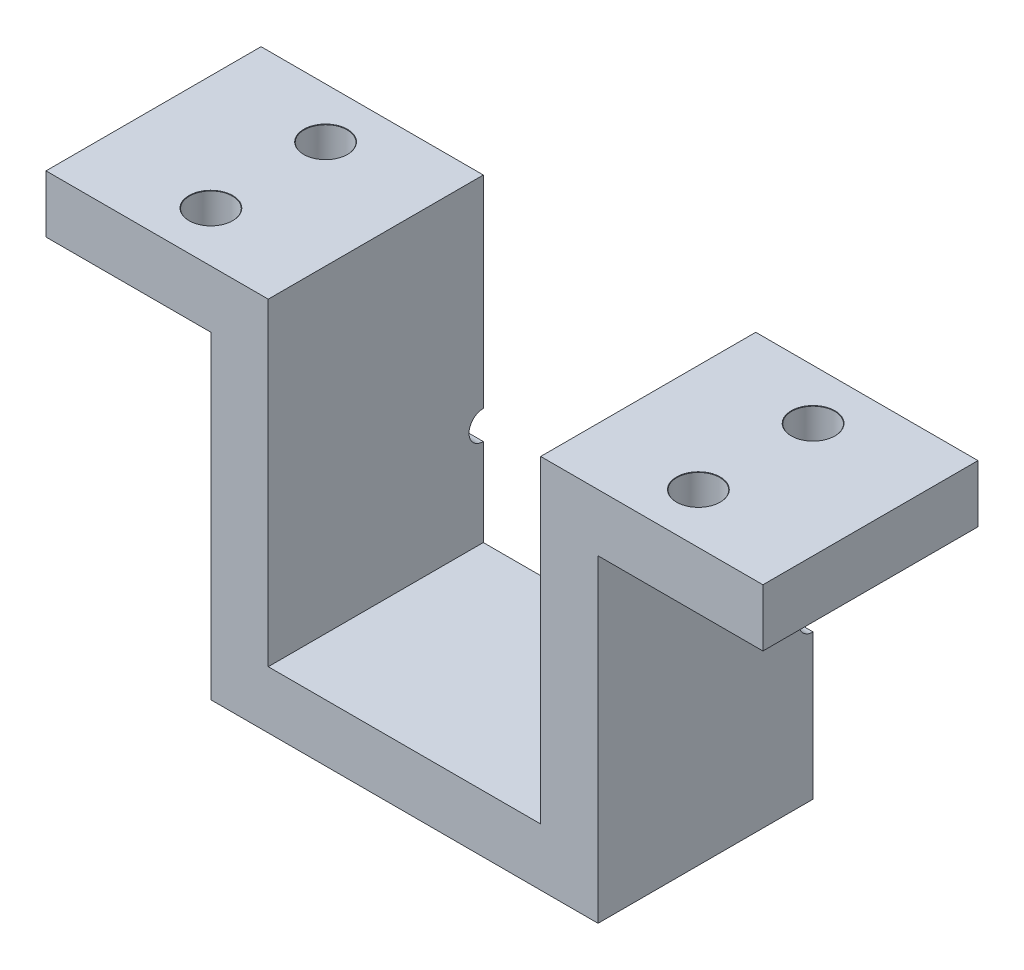
ISO-10303-21;
HEADER;
FILE_DESCRIPTION(('STEP AP214'),'2;1');
FILE_NAME('part.step','',(''),(''),'','','');
FILE_SCHEMA(('AUTOMOTIVE_DESIGN { 1 0 10303 214 1 1 1 1 }'));
ENDSEC;
DATA;
#1=APPLICATION_CONTEXT('core data for automotive mechanical design processes');
#2=APPLICATION_PROTOCOL_DEFINITION('international standard','automotive_design',2000,#1);
#3=PRODUCT_CONTEXT('',#1,'mechanical');
#4=PRODUCT('Part','Part','',(#3));
#5=PRODUCT_RELATED_PRODUCT_CATEGORY('part','',(#4));
#6=PRODUCT_DEFINITION_FORMATION('','',#4);
#7=PRODUCT_DEFINITION_CONTEXT('part definition',#1,'design');
#8=PRODUCT_DEFINITION('design','',#6,#7);
#9=PRODUCT_DEFINITION_SHAPE('','',#8);
#10=(LENGTH_UNIT() NAMED_UNIT(*) SI_UNIT(.MILLI.,.METRE.));
#11=(NAMED_UNIT(*) PLANE_ANGLE_UNIT() SI_UNIT($,.RADIAN.));
#12=(NAMED_UNIT(*) SI_UNIT($,.STERADIAN.) SOLID_ANGLE_UNIT());
#13=UNCERTAINTY_MEASURE_WITH_UNIT(LENGTH_MEASURE(1.E-05),#10,'distance_accuracy_value','');
#14=(GEOMETRIC_REPRESENTATION_CONTEXT(3) GLOBAL_UNCERTAINTY_ASSIGNED_CONTEXT((#13)) GLOBAL_UNIT_ASSIGNED_CONTEXT((#10,
#11,#12)) REPRESENTATION_CONTEXT('',''));
#15=CARTESIAN_POINT('',(0.,0.,0.));
#16=DIRECTION('',(0.,0.,1.));
#17=DIRECTION('',(1.,0.,0.));
#18=AXIS2_PLACEMENT_3D('',#15,#16,#17);
#19=CARTESIAN_POINT('',(0.,22.2,-15.));
#20=DIRECTION('',(0.,0.,1.));
#21=DIRECTION('',(1.,0.,0.));
#22=AXIS2_PLACEMENT_3D('',#19,#20,#21);
#23=PLANE('',#22);
#24=DIRECTION('',(-1.,0.,0.));
#25=VECTOR('',#24,1.);
#26=CARTESIAN_POINT('',(-11.5,26.2,-15.));
#27=LINE('',#26,#25);
#28=CARTESIAN_POINT('',(4.,26.2,-15.));
#29=VERTEX_POINT('',#28);
#30=CARTESIAN_POINT('',(-11.5,26.2,-15.));
#31=VERTEX_POINT('',#30);
#32=EDGE_CURVE('E165',#29,#31,#27,.T.);
#33=ORIENTED_EDGE('',*,*,#32,.F.);
#34=DIRECTION('',(0.,-1.,0.));
#35=VECTOR('',#34,1.);
#36=CARTESIAN_POINT('',(4.,22.2,-15.));
#37=LINE('',#36,#35);
#38=CARTESIAN_POINT('',(4.,12.1,-15.));
#39=VERTEX_POINT('',#38);
#40=EDGE_CURVE('E151',#29,#39,#37,.T.);
#41=ORIENTED_EDGE('',*,*,#40,.T.);
#42=DIRECTION('',(-1.,0.,0.));
#43=VECTOR('',#42,1.);
#44=CARTESIAN_POINT('',(32.2,12.1,-15.));
#45=LINE('',#44,#43);
#46=CARTESIAN_POINT('',(0.,12.1,-15.));
#47=VERTEX_POINT('',#46);
#48=EDGE_CURVE('E54',#39,#47,#45,.T.);
#49=ORIENTED_EDGE('',*,*,#48,.T.);
#50=DIRECTION('',(0.,-1.,0.));
#51=VECTOR('',#50,1.);
#52=CARTESIAN_POINT('',(0.,22.2,-15.));
#53=LINE('',#52,#51);
#54=CARTESIAN_POINT('',(0.,22.2,-15.));
#55=VERTEX_POINT('',#54);
#56=EDGE_CURVE('E254',#55,#47,#53,.T.);
#57=ORIENTED_EDGE('',*,*,#56,.F.);
#58=DIRECTION('',(-1.,0.,0.));
#59=VECTOR('',#58,1.);
#60=CARTESIAN_POINT('',(-11.5,22.2,-15.));
#61=LINE('',#60,#59);
#62=CARTESIAN_POINT('',(-11.5,22.2,-15.));
#63=VERTEX_POINT('',#62);
#64=EDGE_CURVE('E190',#55,#63,#61,.T.);
#65=ORIENTED_EDGE('',*,*,#64,.T.);
#66=DIRECTION('',(0.,-1.,0.));
#67=VECTOR('',#66,1.);
#68=CARTESIAN_POINT('',(-11.5,26.2,-15.));
#69=LINE('',#68,#67);
#70=EDGE_CURVE('E173',#31,#63,#69,.T.);
#71=ORIENTED_EDGE('',*,*,#70,.F.);
#72=EDGE_LOOP('',(#33,#41,#49,#57,#65,#71));
#73=FACE_BOUND('',#72,.T.);
#74=ADVANCED_FACE('F37',(#73),#23,.F.);
#75=CARTESIAN_POINT('',(0.,26.2,0.));
#76=DIRECTION('',(0.,-1.,0.));
#77=DIRECTION('',(0.,0.,-1.));
#78=AXIS2_PLACEMENT_3D('',#75,#76,#77);
#79=PLANE('',#78);
#80=CARTESIAN_POINT('',(-3.5,26.2,-11.5));
#81=DIRECTION('',(0.,1.,0.));
#82=DIRECTION('',(0.,0.,1.));
#83=AXIS2_PLACEMENT_3D('',#80,#81,#82);
#84=CIRCLE('',#83,1.525);
#85=CARTESIAN_POINT('',(-3.5,26.2,-9.975));
#86=VERTEX_POINT('',#85);
#87=EDGE_CURVE('E644',#86,#86,#84,.T.);
#88=ORIENTED_EDGE('',*,*,#87,.F.);
#89=EDGE_LOOP('',(#88));
#90=FACE_BOUND('',#89,.T.);
#91=CARTESIAN_POINT('',(-3.5,26.2,-3.5));
#92=DIRECTION('',(0.,1.,0.));
#93=DIRECTION('',(0.,0.,1.));
#94=AXIS2_PLACEMENT_3D('',#91,#92,#93);
#95=CIRCLE('',#94,1.525);
#96=CARTESIAN_POINT('',(-3.5,26.2,-1.975));
#97=VERTEX_POINT('',#96);
#98=EDGE_CURVE('E283',#97,#97,#95,.T.);
#99=ORIENTED_EDGE('',*,*,#98,.F.);
#100=EDGE_LOOP('',(#99));
#101=FACE_BOUND('',#100,.T.);
#102=DIRECTION('',(1.,0.,0.));
#103=VECTOR('',#102,1.);
#104=CARTESIAN_POINT('',(-11.5,26.2,0.));
#105=LINE('',#104,#103);
#106=CARTESIAN_POINT('',(-11.5,26.2,0.));
#107=VERTEX_POINT('',#106);
#108=CARTESIAN_POINT('',(4.,26.2,0.));
#109=VERTEX_POINT('',#108);
#110=EDGE_CURVE('E168',#107,#109,#105,.T.);
#111=ORIENTED_EDGE('',*,*,#110,.T.);
#112=DIRECTION('',(0.,0.,-1.));
#113=VECTOR('',#112,1.);
#114=CARTESIAN_POINT('',(4.,26.2,0.));
#115=LINE('',#114,#113);
#116=EDGE_CURVE('E154',#109,#29,#115,.T.);
#117=ORIENTED_EDGE('',*,*,#116,.T.);
#118=ORIENTED_EDGE('',*,*,#32,.T.);
#119=DIRECTION('',(0.,0.,1.));
#120=VECTOR('',#119,1.);
#121=CARTESIAN_POINT('',(-11.5,26.2,0.));
#122=LINE('',#121,#120);
#123=EDGE_CURVE('E179',#31,#107,#122,.T.);
#124=ORIENTED_EDGE('',*,*,#123,.T.);
#125=EDGE_LOOP('',(#111,#117,#118,#124));
#126=FACE_BOUND('',#125,.T.);
#127=ADVANCED_FACE('F164',(#90,#101,#126),#79,.F.);
#128=DIRECTION('',(0.,-1.,0.));
#129=VECTOR('',#128,1.);
#130=CARTESIAN_POINT('',(23.,22.2,-15.));
#131=LINE('',#130,#129);
#132=CARTESIAN_POINT('',(23.,26.2,-15.));
#133=VERTEX_POINT('',#132);
#134=CARTESIAN_POINT('',(23.,12.1,-15.));
#135=VERTEX_POINT('',#134);
#136=EDGE_CURVE('E234',#133,#135,#131,.T.);
#137=ORIENTED_EDGE('',*,*,#136,.F.);
#138=CARTESIAN_POINT('',(38.5,26.2,-15.));
#139=VERTEX_POINT('',#138);
#140=EDGE_CURVE('E175',#139,#133,#27,.T.);
#141=ORIENTED_EDGE('',*,*,#140,.F.);
#142=DIRECTION('',(0.,-1.,0.));
#143=VECTOR('',#142,1.);
#144=CARTESIAN_POINT('',(38.5,26.2,-15.));
#145=LINE('',#144,#143);
#146=CARTESIAN_POINT('',(38.5,22.2,-15.));
#147=VERTEX_POINT('',#146);
#148=EDGE_CURVE('E205',#139,#147,#145,.T.);
#149=ORIENTED_EDGE('',*,*,#148,.T.);
#150=CARTESIAN_POINT('',(27.,22.2,-15.));
#151=VERTEX_POINT('',#150);
#152=EDGE_CURVE('E191',#147,#151,#61,.T.);
#153=ORIENTED_EDGE('',*,*,#152,.T.);
#154=DIRECTION('',(0.,-1.,0.));
#155=VECTOR('',#154,1.);
#156=CARTESIAN_POINT('',(27.,22.2,-15.));
#157=LINE('',#156,#155);
#158=CARTESIAN_POINT('',(27.,12.1,-15.));
#159=VERTEX_POINT('',#158);
#160=EDGE_CURVE('E258',#151,#159,#157,.T.);
#161=ORIENTED_EDGE('',*,*,#160,.T.);
#162=EDGE_CURVE('E211',#159,#135,#45,.T.);
#163=ORIENTED_EDGE('',*,*,#162,.T.);
#164=EDGE_LOOP('',(#137,#141,#149,#153,#161,#163));
#165=FACE_BOUND('',#164,.T.);
#166=ADVANCED_FACE('F314',(#165),#23,.F.);
#167=CARTESIAN_POINT('',(0.,22.2,0.));
#168=DIRECTION('',(1.,0.,0.));
#169=DIRECTION('',(0.,0.,-1.));
#170=AXIS2_PLACEMENT_3D('',#167,#168,#169);
#171=PLANE('',#170);
#172=ORIENTED_EDGE('',*,*,#56,.T.);
#173=CARTESIAN_POINT('',(0.,11.1,-15.));
#174=DIRECTION('',(-1.,0.,0.));
#175=DIRECTION('',(0.,0.,1.));
#176=AXIS2_PLACEMENT_3D('',#173,#174,#175);
#177=CIRCLE('',#176,1.);
#178=CARTESIAN_POINT('',(0.,10.1,-15.));
#179=VERTEX_POINT('',#178);
#180=EDGE_CURVE('E208',#179,#47,#177,.T.);
#181=ORIENTED_EDGE('',*,*,#180,.F.);
#182=CARTESIAN_POINT('',(0.,0.,-15.));
#183=VERTEX_POINT('',#182);
#184=EDGE_CURVE('E244',#179,#183,#53,.T.);
#185=ORIENTED_EDGE('',*,*,#184,.T.);
#186=DIRECTION('',(0.,0.,1.));
#187=VECTOR('',#186,1.);
#188=CARTESIAN_POINT('',(0.,0.,0.));
#189=LINE('',#188,#187);
#190=CARTESIAN_POINT('',(0.,0.,0.));
#191=VERTEX_POINT('',#190);
#192=EDGE_CURVE('E229',#183,#191,#189,.T.);
#193=ORIENTED_EDGE('',*,*,#192,.T.);
#194=DIRECTION('',(0.,-1.,0.));
#195=VECTOR('',#194,1.);
#196=CARTESIAN_POINT('',(0.,22.2,0.));
#197=LINE('',#196,#195);
#198=CARTESIAN_POINT('',(0.,22.2,0.));
#199=VERTEX_POINT('',#198);
#200=EDGE_CURVE('E46',#199,#191,#197,.T.);
#201=ORIENTED_EDGE('',*,*,#200,.F.);
#202=DIRECTION('',(0.,0.,1.));
#203=VECTOR('',#202,1.);
#204=CARTESIAN_POINT('',(0.,22.2,0.));
#205=LINE('',#204,#203);
#206=EDGE_CURVE('E239',#55,#199,#205,.T.);
#207=ORIENTED_EDGE('',*,*,#206,.F.);
#208=EDGE_LOOP('',(#172,#181,#185,#193,#201,#207));
#209=FACE_BOUND('',#208,.T.);
#210=ADVANCED_FACE('F39',(#209),#171,.F.);
#211=CARTESIAN_POINT('',(0.,22.2,0.));
#212=DIRECTION('',(0.,0.,-1.));
#213=DIRECTION('',(-1.,0.,0.));
#214=AXIS2_PLACEMENT_3D('',#211,#212,#213);
#215=PLANE('',#214);
#216=DIRECTION('',(0.,-1.,0.));
#217=VECTOR('',#216,1.);
#218=CARTESIAN_POINT('',(4.,22.2,0.));
#219=LINE('',#218,#217);
#220=CARTESIAN_POINT('',(4.,4.,0.));
#221=VERTEX_POINT('',#220);
#222=EDGE_CURVE('E227',#109,#221,#219,.T.);
#223=ORIENTED_EDGE('',*,*,#222,.F.);
#224=ORIENTED_EDGE('',*,*,#110,.F.);
#225=DIRECTION('',(0.,-1.,0.));
#226=VECTOR('',#225,1.);
#227=CARTESIAN_POINT('',(-11.5,26.2,0.));
#228=LINE('',#227,#226);
#229=CARTESIAN_POINT('',(-11.5,22.2,0.));
#230=VERTEX_POINT('',#229);
#231=EDGE_CURVE('E201',#107,#230,#228,.T.);
#232=ORIENTED_EDGE('',*,*,#231,.T.);
#233=DIRECTION('',(1.,0.,0.));
#234=VECTOR('',#233,1.);
#235=CARTESIAN_POINT('',(-11.5,22.2,0.));
#236=LINE('',#235,#234);
#237=EDGE_CURVE('E181',#230,#199,#236,.T.);
#238=ORIENTED_EDGE('',*,*,#237,.T.);
#239=ORIENTED_EDGE('',*,*,#200,.T.);
#240=DIRECTION('',(1.,0.,0.));
#241=VECTOR('',#240,1.);
#242=CARTESIAN_POINT('',(0.,0.,0.));
#243=LINE('',#242,#241);
#244=CARTESIAN_POINT('',(27.,0.,0.));
#245=VERTEX_POINT('',#244);
#246=EDGE_CURVE('E247',#191,#245,#243,.T.);
#247=ORIENTED_EDGE('',*,*,#246,.T.);
#248=DIRECTION('',(0.,-1.,0.));
#249=VECTOR('',#248,1.);
#250=CARTESIAN_POINT('',(27.,22.2,0.));
#251=LINE('',#250,#249);
#252=CARTESIAN_POINT('',(27.,22.2,0.));
#253=VERTEX_POINT('',#252);
#254=EDGE_CURVE('E261',#253,#245,#251,.T.);
#255=ORIENTED_EDGE('',*,*,#254,.F.);
#256=CARTESIAN_POINT('',(38.5,22.2,0.));
#257=VERTEX_POINT('',#256);
#258=EDGE_CURVE('E196',#253,#257,#236,.T.);
#259=ORIENTED_EDGE('',*,*,#258,.T.);
#260=DIRECTION('',(0.,-1.,0.));
#261=VECTOR('',#260,1.);
#262=CARTESIAN_POINT('',(38.5,26.2,0.));
#263=LINE('',#262,#261);
#264=CARTESIAN_POINT('',(38.5,26.2,0.));
#265=VERTEX_POINT('',#264);
#266=EDGE_CURVE('E187',#265,#257,#263,.T.);
#267=ORIENTED_EDGE('',*,*,#266,.F.);
#268=CARTESIAN_POINT('',(23.,26.2,0.));
#269=VERTEX_POINT('',#268);
#270=EDGE_CURVE('E185',#269,#265,#105,.T.);
#271=ORIENTED_EDGE('',*,*,#270,.F.);
#272=DIRECTION('',(0.,-1.,0.));
#273=VECTOR('',#272,1.);
#274=CARTESIAN_POINT('',(23.,22.2,0.));
#275=LINE('',#274,#273);
#276=CARTESIAN_POINT('',(23.,4.,0.));
#277=VERTEX_POINT('',#276);
#278=EDGE_CURVE('E230',#269,#277,#275,.T.);
#279=ORIENTED_EDGE('',*,*,#278,.T.);
#280=DIRECTION('',(1.,0.,0.));
#281=VECTOR('',#280,1.);
#282=CARTESIAN_POINT('',(0.,4.,0.));
#283=LINE('',#282,#281);
#284=EDGE_CURVE('E222',#221,#277,#283,.T.);
#285=ORIENTED_EDGE('',*,*,#284,.F.);
#286=EDGE_LOOP('',(#223,#224,#232,#238,#239,#247,#255,#259,#267,#271,#279,#285));
#287=FACE_BOUND('',#286,.T.);
#288=ADVANCED_FACE('F305',(#287),#215,.F.);
#289=CARTESIAN_POINT('',(27.,22.2,0.));
#290=DIRECTION('',(-1.,0.,0.));
#291=DIRECTION('',(0.,0.,1.));
#292=AXIS2_PLACEMENT_3D('',#289,#290,#291);
#293=PLANE('',#292);
#294=CARTESIAN_POINT('',(27.,10.1,-15.));
#295=VERTEX_POINT('',#294);
#296=CARTESIAN_POINT('',(27.,0.,-15.));
#297=VERTEX_POINT('',#296);
#298=EDGE_CURVE('E257',#295,#297,#157,.T.);
#299=ORIENTED_EDGE('',*,*,#298,.F.);
#300=CARTESIAN_POINT('',(27.,11.1,-15.));
#301=DIRECTION('',(-1.,0.,0.));
#302=DIRECTION('',(0.,0.,1.));
#303=AXIS2_PLACEMENT_3D('',#300,#301,#302);
#304=CIRCLE('',#303,1.);
#305=EDGE_CURVE('E215',#295,#159,#304,.T.);
#306=ORIENTED_EDGE('',*,*,#305,.T.);
#307=ORIENTED_EDGE('',*,*,#160,.F.);
#308=DIRECTION('',(0.,0.,-1.));
#309=VECTOR('',#308,1.);
#310=CARTESIAN_POINT('',(27.,22.2,0.));
#311=LINE('',#310,#309);
#312=EDGE_CURVE('E241',#253,#151,#311,.T.);
#313=ORIENTED_EDGE('',*,*,#312,.F.);
#314=ORIENTED_EDGE('',*,*,#254,.T.);
#315=DIRECTION('',(0.,0.,-1.));
#316=VECTOR('',#315,1.);
#317=CARTESIAN_POINT('',(27.,0.,0.));
#318=LINE('',#317,#316);
#319=EDGE_CURVE('E249',#245,#297,#318,.T.);
#320=ORIENTED_EDGE('',*,*,#319,.T.);
#321=EDGE_LOOP('',(#299,#306,#307,#313,#314,#320));
#322=FACE_BOUND('',#321,.T.);
#323=ADVANCED_FACE('F344',(#322),#293,.F.);
#324=ORIENTED_EDGE('',*,*,#184,.F.);
#325=DIRECTION('',(-1.,0.,0.));
#326=VECTOR('',#325,1.);
#327=CARTESIAN_POINT('',(32.2,10.1,-15.));
#328=LINE('',#327,#326);
#329=CARTESIAN_POINT('',(4.,10.1,-15.));
#330=VERTEX_POINT('',#329);
#331=EDGE_CURVE('E212',#179,#330,#328,.F.);
#332=ORIENTED_EDGE('',*,*,#331,.T.);
#333=CARTESIAN_POINT('',(4.,4.,-15.));
#334=VERTEX_POINT('',#333);
#335=EDGE_CURVE('E161',#330,#334,#37,.T.);
#336=ORIENTED_EDGE('',*,*,#335,.T.);
#337=DIRECTION('',(-1.,0.,0.));
#338=VECTOR('',#337,1.);
#339=CARTESIAN_POINT('',(0.,4.,-15.));
#340=LINE('',#339,#338);
#341=CARTESIAN_POINT('',(23.,4.,-15.));
#342=VERTEX_POINT('',#341);
#343=EDGE_CURVE('E226',#342,#334,#340,.T.);
#344=ORIENTED_EDGE('',*,*,#343,.F.);
#345=CARTESIAN_POINT('',(23.,10.1,-15.));
#346=VERTEX_POINT('',#345);
#347=EDGE_CURVE('E160',#346,#342,#131,.T.);
#348=ORIENTED_EDGE('',*,*,#347,.F.);
#349=EDGE_CURVE('E61',#346,#295,#328,.F.);
#350=ORIENTED_EDGE('',*,*,#349,.T.);
#351=ORIENTED_EDGE('',*,*,#298,.T.);
#352=DIRECTION('',(-1.,0.,0.));
#353=VECTOR('',#352,1.);
#354=CARTESIAN_POINT('',(0.,0.,-15.));
#355=LINE('',#354,#353);
#356=EDGE_CURVE('E242',#297,#183,#355,.T.);
#357=ORIENTED_EDGE('',*,*,#356,.T.);
#358=EDGE_LOOP('',(#324,#332,#336,#344,#348,#350,#351,#357));
#359=FACE_BOUND('',#358,.T.);
#360=ADVANCED_FACE('F322',(#359),#23,.F.);
#361=CARTESIAN_POINT('',(0.,0.,0.));
#362=DIRECTION('',(0.,-1.,0.));
#363=DIRECTION('',(0.,0.,-1.));
#364=AXIS2_PLACEMENT_3D('',#361,#362,#363);
#365=PLANE('',#364);
#366=ORIENTED_EDGE('',*,*,#192,.F.);
#367=ORIENTED_EDGE('',*,*,#356,.F.);
#368=ORIENTED_EDGE('',*,*,#319,.F.);
#369=ORIENTED_EDGE('',*,*,#246,.F.);
#370=EDGE_LOOP('',(#366,#367,#368,#369));
#371=FACE_BOUND('',#370,.T.);
#372=ADVANCED_FACE('F346',(#371),#365,.T.);
#373=CARTESIAN_POINT('',(4.,22.2,0.));
#374=DIRECTION('',(1.,0.,0.));
#375=DIRECTION('',(0.,0.,-1.));
#376=AXIS2_PLACEMENT_3D('',#373,#374,#375);
#377=PLANE('',#376);
#378=CARTESIAN_POINT('',(4.,11.1,-15.));
#379=DIRECTION('',(1.,0.,0.));
#380=DIRECTION('',(0.,0.,-1.));
#381=AXIS2_PLACEMENT_3D('',#378,#379,#380);
#382=CIRCLE('',#381,1.);
#383=EDGE_CURVE('E157',#39,#330,#382,.T.);
#384=ORIENTED_EDGE('',*,*,#383,.F.);
#385=ORIENTED_EDGE('',*,*,#40,.F.);
#386=ORIENTED_EDGE('',*,*,#116,.F.);
#387=ORIENTED_EDGE('',*,*,#222,.T.);
#388=DIRECTION('',(0.,0.,1.));
#389=VECTOR('',#388,1.);
#390=CARTESIAN_POINT('',(4.,4.,0.));
#391=LINE('',#390,#389);
#392=EDGE_CURVE('E219',#334,#221,#391,.T.);
#393=ORIENTED_EDGE('',*,*,#392,.F.);
#394=ORIENTED_EDGE('',*,*,#335,.F.);
#395=EDGE_LOOP('',(#384,#385,#386,#387,#393,#394));
#396=FACE_BOUND('',#395,.T.);
#397=ADVANCED_FACE('F153',(#396),#377,.T.);
#398=CARTESIAN_POINT('',(23.,22.2,0.));
#399=DIRECTION('',(-1.,0.,0.));
#400=DIRECTION('',(0.,0.,1.));
#401=AXIS2_PLACEMENT_3D('',#398,#399,#400);
#402=PLANE('',#401);
#403=CARTESIAN_POINT('',(23.,11.1,-15.));
#404=DIRECTION('',(-1.,0.,0.));
#405=DIRECTION('',(0.,0.,1.));
#406=AXIS2_PLACEMENT_3D('',#403,#404,#405);
#407=CIRCLE('',#406,1.);
#408=EDGE_CURVE('E11',#346,#135,#407,.T.);
#409=ORIENTED_EDGE('',*,*,#408,.F.);
#410=ORIENTED_EDGE('',*,*,#347,.T.);
#411=DIRECTION('',(0.,0.,-1.));
#412=VECTOR('',#411,1.);
#413=CARTESIAN_POINT('',(23.,4.,0.));
#414=LINE('',#413,#412);
#415=EDGE_CURVE('E223',#277,#342,#414,.T.);
#416=ORIENTED_EDGE('',*,*,#415,.F.);
#417=ORIENTED_EDGE('',*,*,#278,.F.);
#418=DIRECTION('',(0.,0.,1.));
#419=VECTOR('',#418,1.);
#420=CARTESIAN_POINT('',(23.,26.2,0.));
#421=LINE('',#420,#419);
#422=EDGE_CURVE('E170',#133,#269,#421,.T.);
#423=ORIENTED_EDGE('',*,*,#422,.F.);
#424=ORIENTED_EDGE('',*,*,#136,.T.);
#425=EDGE_LOOP('',(#409,#410,#416,#417,#423,#424));
#426=FACE_BOUND('',#425,.T.);
#427=ADVANCED_FACE('F316',(#426),#402,.T.);
#428=CARTESIAN_POINT('',(0.,4.,0.));
#429=DIRECTION('',(0.,-1.,0.));
#430=DIRECTION('',(0.,0.,-1.));
#431=AXIS2_PLACEMENT_3D('',#428,#429,#430);
#432=PLANE('',#431);
#433=ORIENTED_EDGE('',*,*,#392,.T.);
#434=ORIENTED_EDGE('',*,*,#284,.T.);
#435=ORIENTED_EDGE('',*,*,#415,.T.);
#436=ORIENTED_EDGE('',*,*,#343,.T.);
#437=EDGE_LOOP('',(#433,#434,#435,#436));
#438=FACE_BOUND('',#437,.T.);
#439=ADVANCED_FACE('F327',(#438),#432,.F.);
#440=CARTESIAN_POINT('',(32.2,11.1,-15.));
#441=DIRECTION('',(-1.,0.,0.));
#442=DIRECTION('',(0.,0.,1.));
#443=AXIS2_PLACEMENT_3D('',#440,#441,#442);
#444=CYLINDRICAL_SURFACE('',#443,1.);
#445=ORIENTED_EDGE('',*,*,#349,.F.);
#446=ORIENTED_EDGE('',*,*,#408,.T.);
#447=ORIENTED_EDGE('',*,*,#162,.F.);
#448=ORIENTED_EDGE('',*,*,#305,.F.);
#449=EDGE_LOOP('',(#445,#446,#447,#448));
#450=FACE_BOUND('',#449,.T.);
#451=ADVANCED_FACE('F347',(#450),#444,.F.);
#452=ORIENTED_EDGE('',*,*,#383,.T.);
#453=ORIENTED_EDGE('',*,*,#331,.F.);
#454=ORIENTED_EDGE('',*,*,#180,.T.);
#455=ORIENTED_EDGE('',*,*,#48,.F.);
#456=EDGE_LOOP('',(#452,#453,#454,#455));
#457=FACE_BOUND('',#456,.T.);
#458=ADVANCED_FACE('F349',(#457),#444,.F.);
#459=CARTESIAN_POINT('',(0.,22.2,0.));
#460=DIRECTION('',(0.,-1.,0.));
#461=DIRECTION('',(0.,0.,-1.));
#462=AXIS2_PLACEMENT_3D('',#459,#460,#461);
#463=PLANE('',#462);
#464=CARTESIAN_POINT('',(-3.5,22.2,-11.5));
#465=DIRECTION('',(0.,-1.,0.));
#466=DIRECTION('',(0.,0.,-1.));
#467=AXIS2_PLACEMENT_3D('',#464,#465,#466);
#468=CIRCLE('',#467,1.5);
#469=CARTESIAN_POINT('',(-3.5,22.2,-13.));
#470=VERTEX_POINT('',#469);
#471=EDGE_CURVE('E41',#470,#470,#468,.T.);
#472=ORIENTED_EDGE('',*,*,#471,.F.);
#473=EDGE_LOOP('',(#472));
#474=FACE_BOUND('',#473,.T.);
#475=CARTESIAN_POINT('',(-3.5,22.2,-3.5));
#476=DIRECTION('',(0.,-1.,0.));
#477=DIRECTION('',(0.,0.,-1.));
#478=AXIS2_PLACEMENT_3D('',#475,#476,#477);
#479=CIRCLE('',#478,1.5);
#480=CARTESIAN_POINT('',(-3.5,22.2,-5.));
#481=VERTEX_POINT('',#480);
#482=EDGE_CURVE('E274',#481,#481,#479,.T.);
#483=ORIENTED_EDGE('',*,*,#482,.F.);
#484=EDGE_LOOP('',(#483));
#485=FACE_BOUND('',#484,.T.);
#486=ORIENTED_EDGE('',*,*,#206,.T.);
#487=ORIENTED_EDGE('',*,*,#237,.F.);
#488=DIRECTION('',(0.,0.,1.));
#489=VECTOR('',#488,1.);
#490=CARTESIAN_POINT('',(-11.5,22.2,0.));
#491=LINE('',#490,#489);
#492=EDGE_CURVE('E194',#63,#230,#491,.T.);
#493=ORIENTED_EDGE('',*,*,#492,.F.);
#494=ORIENTED_EDGE('',*,*,#64,.F.);
#495=EDGE_LOOP('',(#486,#487,#493,#494));
#496=FACE_BOUND('',#495,.T.);
#497=ADVANCED_FACE('F334',(#474,#485,#496),#463,.T.);
#498=CARTESIAN_POINT('',(30.5,22.2,-11.5));
#499=DIRECTION('',(0.,-1.,0.));
#500=DIRECTION('',(0.,0.,-1.));
#501=AXIS2_PLACEMENT_3D('',#498,#499,#500);
#502=CIRCLE('',#501,1.5);
#503=CARTESIAN_POINT('',(30.5,22.2,-13.));
#504=VERTEX_POINT('',#503);
#505=EDGE_CURVE('E270',#504,#504,#502,.T.);
#506=ORIENTED_EDGE('',*,*,#505,.F.);
#507=EDGE_LOOP('',(#506));
#508=FACE_BOUND('',#507,.T.);
#509=CARTESIAN_POINT('',(30.5,22.2,-3.5));
#510=DIRECTION('',(0.,-1.,0.));
#511=DIRECTION('',(0.,0.,-1.));
#512=AXIS2_PLACEMENT_3D('',#509,#510,#511);
#513=CIRCLE('',#512,1.5);
#514=CARTESIAN_POINT('',(30.5,22.2,-5.));
#515=VERTEX_POINT('',#514);
#516=EDGE_CURVE('E266',#515,#515,#513,.T.);
#517=ORIENTED_EDGE('',*,*,#516,.F.);
#518=EDGE_LOOP('',(#517));
#519=FACE_BOUND('',#518,.T.);
#520=ORIENTED_EDGE('',*,*,#312,.T.);
#521=ORIENTED_EDGE('',*,*,#152,.F.);
#522=DIRECTION('',(0.,0.,-1.));
#523=VECTOR('',#522,1.);
#524=CARTESIAN_POINT('',(38.5,22.2,0.));
#525=LINE('',#524,#523);
#526=EDGE_CURVE('E169',#257,#147,#525,.T.);
#527=ORIENTED_EDGE('',*,*,#526,.F.);
#528=ORIENTED_EDGE('',*,*,#258,.F.);
#529=EDGE_LOOP('',(#520,#521,#527,#528));
#530=FACE_BOUND('',#529,.T.);
#531=ADVANCED_FACE('F405',(#508,#519,#530),#463,.T.);
#532=CARTESIAN_POINT('',(38.5,26.2,0.));
#533=DIRECTION('',(-1.,0.,0.));
#534=DIRECTION('',(0.,0.,1.));
#535=AXIS2_PLACEMENT_3D('',#532,#533,#534);
#536=PLANE('',#535);
#537=ORIENTED_EDGE('',*,*,#526,.T.);
#538=ORIENTED_EDGE('',*,*,#148,.F.);
#539=DIRECTION('',(0.,0.,-1.));
#540=VECTOR('',#539,1.);
#541=CARTESIAN_POINT('',(38.5,26.2,0.));
#542=LINE('',#541,#540);
#543=EDGE_CURVE('E176',#265,#139,#542,.T.);
#544=ORIENTED_EDGE('',*,*,#543,.F.);
#545=ORIENTED_EDGE('',*,*,#266,.T.);
#546=EDGE_LOOP('',(#537,#538,#544,#545));
#547=FACE_BOUND('',#546,.T.);
#548=ADVANCED_FACE('F312',(#547),#536,.F.);
#549=CARTESIAN_POINT('',(-11.5,26.2,0.));
#550=DIRECTION('',(1.,0.,0.));
#551=DIRECTION('',(0.,0.,-1.));
#552=AXIS2_PLACEMENT_3D('',#549,#550,#551);
#553=PLANE('',#552);
#554=ORIENTED_EDGE('',*,*,#492,.T.);
#555=ORIENTED_EDGE('',*,*,#231,.F.);
#556=ORIENTED_EDGE('',*,*,#123,.F.);
#557=ORIENTED_EDGE('',*,*,#70,.T.);
#558=EDGE_LOOP('',(#554,#555,#556,#557));
#559=FACE_BOUND('',#558,.T.);
#560=ADVANCED_FACE('F421',(#559),#553,.F.);
#561=CARTESIAN_POINT('',(30.5,26.2,-11.5));
#562=DIRECTION('',(0.,1.,0.));
#563=DIRECTION('',(0.,0.,1.));
#564=AXIS2_PLACEMENT_3D('',#561,#562,#563);
#565=CIRCLE('',#564,1.525);
#566=CARTESIAN_POINT('',(30.5,26.2,-9.975));
#567=VERTEX_POINT('',#566);
#568=EDGE_CURVE('E276',#567,#567,#565,.T.);
#569=ORIENTED_EDGE('',*,*,#568,.F.);
#570=EDGE_LOOP('',(#569));
#571=FACE_BOUND('',#570,.T.);
#572=CARTESIAN_POINT('',(30.5,26.2,-3.5));
#573=DIRECTION('',(0.,1.,0.));
#574=DIRECTION('',(0.,0.,1.));
#575=AXIS2_PLACEMENT_3D('',#572,#573,#574);
#576=CIRCLE('',#575,1.525);
#577=CARTESIAN_POINT('',(30.5,26.2,-1.975));
#578=VERTEX_POINT('',#577);
#579=EDGE_CURVE('E272',#578,#578,#576,.T.);
#580=ORIENTED_EDGE('',*,*,#579,.F.);
#581=EDGE_LOOP('',(#580));
#582=FACE_BOUND('',#581,.T.);
#583=ORIENTED_EDGE('',*,*,#140,.T.);
#584=ORIENTED_EDGE('',*,*,#422,.T.);
#585=ORIENTED_EDGE('',*,*,#270,.T.);
#586=ORIENTED_EDGE('',*,*,#543,.T.);
#587=EDGE_LOOP('',(#583,#584,#585,#586));
#588=FACE_BOUND('',#587,.T.);
#589=ADVANCED_FACE('F301',(#571,#582,#588),#79,.F.);
#590=CARTESIAN_POINT('',(30.5,26.2,-3.5));
#591=DIRECTION('',(0.,1.,0.));
#592=DIRECTION('',(0.,0.,1.));
#593=AXIS2_PLACEMENT_3D('',#590,#591,#592);
#594=CYLINDRICAL_SURFACE('',#593,1.5);
#595=ORIENTED_EDGE('',*,*,#516,.T.);
#596=EDGE_LOOP('',(#595));
#597=FACE_BOUND('',#596,.T.);
#598=CARTESIAN_POINT('',(30.5,26.175,-3.5));
#599=DIRECTION('',(0.,1.,0.));
#600=DIRECTION('',(0.,0.,1.));
#601=AXIS2_PLACEMENT_3D('',#598,#599,#600);
#602=CIRCLE('',#601,1.5);
#603=CARTESIAN_POINT('',(30.5,26.175,-2.));
#604=VERTEX_POINT('',#603);
#605=EDGE_CURVE('E269',#604,#604,#602,.T.);
#606=ORIENTED_EDGE('',*,*,#605,.T.);
#607=EDGE_LOOP('',(#606));
#608=FACE_BOUND('',#607,.T.);
#609=ADVANCED_FACE('F420',(#597,#608),#594,.F.);
#610=CARTESIAN_POINT('',(30.5,26.2,-3.5));
#611=DIRECTION('',(0.,1.,0.));
#612=DIRECTION('',(0.,0.,1.));
#613=AXIS2_PLACEMENT_3D('',#610,#611,#612);
#614=CONICAL_SURFACE('',#613,1.525,0.785398163397379);
#615=ORIENTED_EDGE('',*,*,#605,.F.);
#616=EDGE_LOOP('',(#615));
#617=FACE_BOUND('',#616,.T.);
#618=ORIENTED_EDGE('',*,*,#579,.T.);
#619=EDGE_LOOP('',(#618));
#620=FACE_BOUND('',#619,.T.);
#621=ADVANCED_FACE('F430',(#617,#620),#614,.F.);
#622=CARTESIAN_POINT('',(30.5,26.2,-11.5));
#623=DIRECTION('',(0.,1.,0.));
#624=DIRECTION('',(0.,0.,1.));
#625=AXIS2_PLACEMENT_3D('',#622,#623,#624);
#626=CYLINDRICAL_SURFACE('',#625,1.5);
#627=ORIENTED_EDGE('',*,*,#505,.T.);
#628=EDGE_LOOP('',(#627));
#629=FACE_BOUND('',#628,.T.);
#630=CARTESIAN_POINT('',(30.5,26.175,-11.5));
#631=DIRECTION('',(0.,1.,0.));
#632=DIRECTION('',(0.,0.,1.));
#633=AXIS2_PLACEMENT_3D('',#630,#631,#632);
#634=CIRCLE('',#633,1.5);
#635=CARTESIAN_POINT('',(30.5,26.175,-10.));
#636=VERTEX_POINT('',#635);
#637=EDGE_CURVE('E273',#636,#636,#634,.T.);
#638=ORIENTED_EDGE('',*,*,#637,.T.);
#639=EDGE_LOOP('',(#638));
#640=FACE_BOUND('',#639,.T.);
#641=ADVANCED_FACE('F441',(#629,#640),#626,.F.);
#642=CARTESIAN_POINT('',(30.5,26.2,-11.5));
#643=DIRECTION('',(0.,1.,0.));
#644=DIRECTION('',(0.,0.,1.));
#645=AXIS2_PLACEMENT_3D('',#642,#643,#644);
#646=CONICAL_SURFACE('',#645,1.525,0.785398163397379);
#647=ORIENTED_EDGE('',*,*,#637,.F.);
#648=EDGE_LOOP('',(#647));
#649=FACE_BOUND('',#648,.T.);
#650=ORIENTED_EDGE('',*,*,#568,.T.);
#651=EDGE_LOOP('',(#650));
#652=FACE_BOUND('',#651,.T.);
#653=ADVANCED_FACE('F452',(#649,#652),#646,.F.);
#654=CARTESIAN_POINT('',(-3.5,26.2,-3.5));
#655=DIRECTION('',(0.,1.,0.));
#656=DIRECTION('',(0.,0.,1.));
#657=AXIS2_PLACEMENT_3D('',#654,#655,#656);
#658=CYLINDRICAL_SURFACE('',#657,1.5);
#659=ORIENTED_EDGE('',*,*,#482,.T.);
#660=EDGE_LOOP('',(#659));
#661=FACE_BOUND('',#660,.T.);
#662=CARTESIAN_POINT('',(-3.5,26.175,-3.5));
#663=DIRECTION('',(0.,1.,0.));
#664=DIRECTION('',(0.,0.,1.));
#665=AXIS2_PLACEMENT_3D('',#662,#663,#664);
#666=CIRCLE('',#665,1.5);
#667=CARTESIAN_POINT('',(-3.5,26.175,-2.));
#668=VERTEX_POINT('',#667);
#669=EDGE_CURVE('E277',#668,#668,#666,.T.);
#670=ORIENTED_EDGE('',*,*,#669,.T.);
#671=EDGE_LOOP('',(#670));
#672=FACE_BOUND('',#671,.T.);
#673=ADVANCED_FACE('F463',(#661,#672),#658,.F.);
#674=CARTESIAN_POINT('',(-3.5,26.2,-3.5));
#675=DIRECTION('',(0.,1.,0.));
#676=DIRECTION('',(0.,0.,1.));
#677=AXIS2_PLACEMENT_3D('',#674,#675,#676);
#678=CONICAL_SURFACE('',#677,1.525,0.78539816339744);
#679=ORIENTED_EDGE('',*,*,#669,.F.);
#680=EDGE_LOOP('',(#679));
#681=FACE_BOUND('',#680,.T.);
#682=ORIENTED_EDGE('',*,*,#98,.T.);
#683=EDGE_LOOP('',(#682));
#684=FACE_BOUND('',#683,.T.);
#685=ADVANCED_FACE('F474',(#681,#684),#678,.F.);
#686=CARTESIAN_POINT('',(-3.5,26.2,-11.5));
#687=DIRECTION('',(0.,1.,0.));
#688=DIRECTION('',(0.,0.,1.));
#689=AXIS2_PLACEMENT_3D('',#686,#687,#688);
#690=CYLINDRICAL_SURFACE('',#689,1.5);
#691=ORIENTED_EDGE('',*,*,#471,.T.);
#692=EDGE_LOOP('',(#691));
#693=FACE_BOUND('',#692,.T.);
#694=CARTESIAN_POINT('',(-3.5,26.175,-11.5));
#695=DIRECTION('',(0.,1.,0.));
#696=DIRECTION('',(0.,0.,1.));
#697=AXIS2_PLACEMENT_3D('',#694,#695,#696);
#698=CIRCLE('',#697,1.5);
#699=CARTESIAN_POINT('',(-3.5,26.175,-10.));
#700=VERTEX_POINT('',#699);
#701=EDGE_CURVE('E641',#700,#700,#698,.T.);
#702=ORIENTED_EDGE('',*,*,#701,.T.);
#703=EDGE_LOOP('',(#702));
#704=FACE_BOUND('',#703,.T.);
#705=ADVANCED_FACE('F484',(#693,#704),#690,.F.);
#706=CARTESIAN_POINT('',(-3.5,26.2,-11.5));
#707=DIRECTION('',(0.,1.,0.));
#708=DIRECTION('',(0.,0.,1.));
#709=AXIS2_PLACEMENT_3D('',#706,#707,#708);
#710=CONICAL_SURFACE('',#709,1.525,0.78539816339744);
#711=ORIENTED_EDGE('',*,*,#701,.F.);
#712=EDGE_LOOP('',(#711));
#713=FACE_BOUND('',#712,.T.);
#714=ORIENTED_EDGE('',*,*,#87,.T.);
#715=EDGE_LOOP('',(#714));
#716=FACE_BOUND('',#715,.T.);
#717=ADVANCED_FACE('F495',(#713,#716),#710,.F.);
#718=CLOSED_SHELL('',(#74,#127,#166,#210,#288,#323,#360,#372,#397,#427,#439,#451,#458,#497,#531,
#548,#560,#589,#609,#621,#641,#653,#673,#685,#705,#717));
#719=MANIFOLD_SOLID_BREP('B2',#718);
#720=ADVANCED_BREP_SHAPE_REPRESENTATION('',(#18,#719),#14);
#721=SHAPE_DEFINITION_REPRESENTATION(#9,#720);
ENDSEC;
END-ISO-10303-21;
